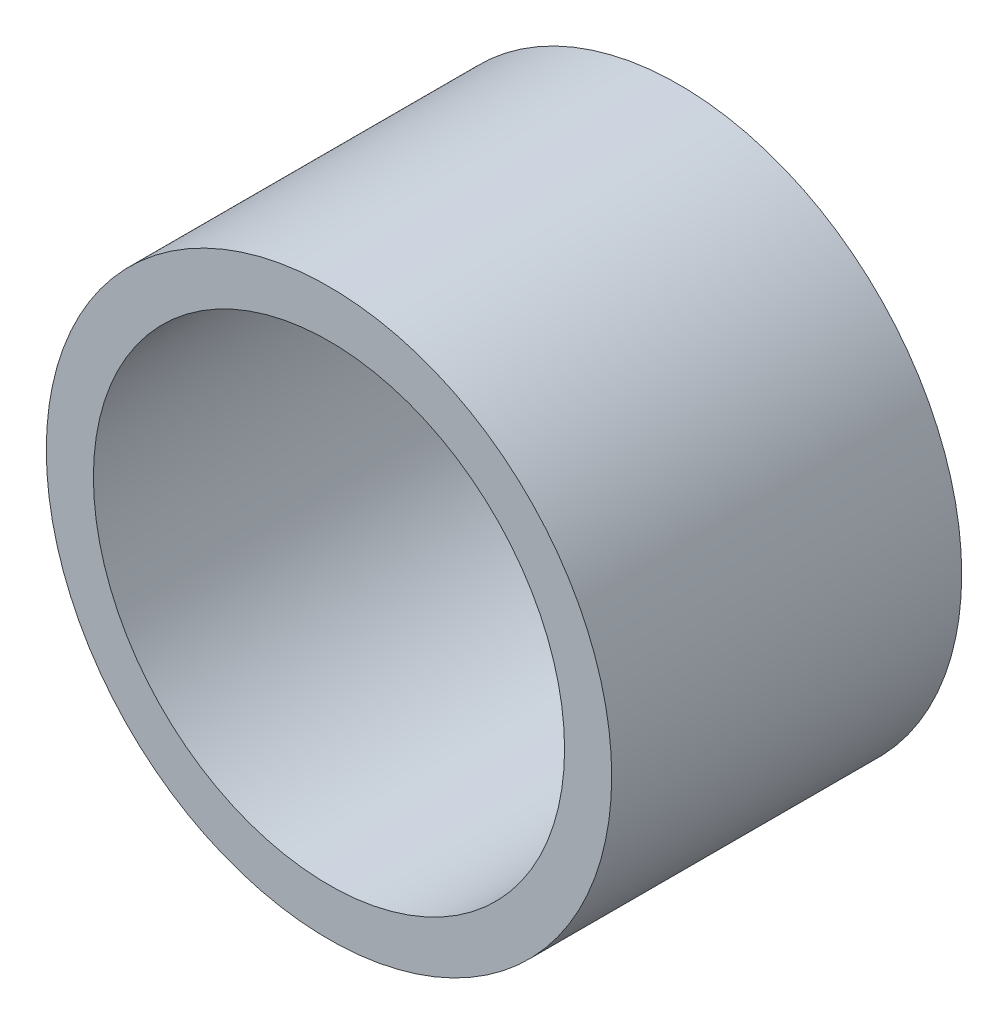
ISO-10303-21;
HEADER;
FILE_DESCRIPTION(('STEP AP214'),'2;1');
FILE_NAME('part.step','',(''),(''),'','','');
FILE_SCHEMA(('AUTOMOTIVE_DESIGN { 1 0 10303 214 1 1 1 1 }'));
ENDSEC;
DATA;
#1=APPLICATION_CONTEXT('core data for automotive mechanical design processes');
#2=APPLICATION_PROTOCOL_DEFINITION('international standard','automotive_design',2000,#1);
#3=PRODUCT_CONTEXT('',#1,'mechanical');
#4=PRODUCT('Part','Part','',(#3));
#5=PRODUCT_RELATED_PRODUCT_CATEGORY('part','',(#4));
#6=PRODUCT_DEFINITION_FORMATION('','',#4);
#7=PRODUCT_DEFINITION_CONTEXT('part definition',#1,'design');
#8=PRODUCT_DEFINITION('design','',#6,#7);
#9=PRODUCT_DEFINITION_SHAPE('','',#8);
#10=(LENGTH_UNIT() NAMED_UNIT(*) SI_UNIT(.MILLI.,.METRE.));
#11=(NAMED_UNIT(*) PLANE_ANGLE_UNIT() SI_UNIT($,.RADIAN.));
#12=(NAMED_UNIT(*) SI_UNIT($,.STERADIAN.) SOLID_ANGLE_UNIT());
#13=UNCERTAINTY_MEASURE_WITH_UNIT(LENGTH_MEASURE(1.E-05),#10,'distance_accuracy_value','');
#14=(GEOMETRIC_REPRESENTATION_CONTEXT(3) GLOBAL_UNCERTAINTY_ASSIGNED_CONTEXT((#13)) GLOBAL_UNIT_ASSIGNED_CONTEXT((#10,
#11,#12)) REPRESENTATION_CONTEXT('',''));
#15=CARTESIAN_POINT('',(0.,0.,0.));
#16=DIRECTION('',(0.,0.,1.));
#17=DIRECTION('',(1.,0.,0.));
#18=AXIS2_PLACEMENT_3D('',#15,#16,#17);
#19=CARTESIAN_POINT('',(0.,0.,26.));
#20=DIRECTION('',(0.,0.,1.));
#21=DIRECTION('',(1.,0.,0.));
#22=AXIS2_PLACEMENT_3D('',#19,#20,#21);
#23=PLANE('',#22);
#24=CARTESIAN_POINT('',(0.,0.,26.));
#25=DIRECTION('',(0.,0.,1.));
#26=DIRECTION('',(1.,0.,0.));
#27=AXIS2_PLACEMENT_3D('',#24,#25,#26);
#28=CIRCLE('',#27,21.);
#29=CARTESIAN_POINT('',(-21.,0.,26.));
#30=VERTEX_POINT('',#29);
#31=EDGE_CURVE('E10',#30,#30,#28,.T.);
#32=ORIENTED_EDGE('',*,*,#31,.T.);
#33=EDGE_LOOP('',(#32));
#34=FACE_BOUND('',#33,.T.);
#35=CARTESIAN_POINT('',(0.,0.,26.));
#36=DIRECTION('',(0.,0.,1.));
#37=DIRECTION('',(1.,0.,0.));
#38=AXIS2_PLACEMENT_3D('',#35,#36,#37);
#39=CIRCLE('',#38,17.5);
#40=CARTESIAN_POINT('',(-17.5,0.,26.));
#41=VERTEX_POINT('',#40);
#42=EDGE_CURVE('E42',#41,#41,#39,.T.);
#43=ORIENTED_EDGE('',*,*,#42,.F.);
#44=EDGE_LOOP('',(#43));
#45=FACE_BOUND('',#44,.T.);
#46=ADVANCED_FACE('F31',(#34,#45),#23,.T.);
#47=CARTESIAN_POINT('',(0.,0.,0.));
#48=DIRECTION('',(0.,0.,1.));
#49=DIRECTION('',(1.,0.,0.));
#50=AXIS2_PLACEMENT_3D('',#47,#48,#49);
#51=PLANE('',#50);
#52=CARTESIAN_POINT('',(0.,0.,0.));
#53=DIRECTION('',(0.,0.,1.));
#54=DIRECTION('',(1.,0.,0.));
#55=AXIS2_PLACEMENT_3D('',#52,#53,#54);
#56=CIRCLE('',#55,21.);
#57=CARTESIAN_POINT('',(-21.,0.,0.));
#58=VERTEX_POINT('',#57);
#59=EDGE_CURVE('E35',#58,#58,#56,.T.);
#60=ORIENTED_EDGE('',*,*,#59,.F.);
#61=EDGE_LOOP('',(#60));
#62=FACE_BOUND('',#61,.T.);
#63=CARTESIAN_POINT('',(0.,0.,0.));
#64=DIRECTION('',(0.,0.,1.));
#65=DIRECTION('',(1.,0.,0.));
#66=AXIS2_PLACEMENT_3D('',#63,#64,#65);
#67=CIRCLE('',#66,17.5);
#68=CARTESIAN_POINT('',(-17.5,0.,0.));
#69=VERTEX_POINT('',#68);
#70=EDGE_CURVE('E44',#69,#69,#67,.T.);
#71=ORIENTED_EDGE('',*,*,#70,.T.);
#72=EDGE_LOOP('',(#71));
#73=FACE_BOUND('',#72,.T.);
#74=ADVANCED_FACE('F54',(#62,#73),#51,.F.);
#75=CARTESIAN_POINT('',(0.,0.,26.));
#76=DIRECTION('',(0.,0.,-1.));
#77=DIRECTION('',(-1.,0.,0.));
#78=AXIS2_PLACEMENT_3D('',#75,#76,#77);
#79=CYLINDRICAL_SURFACE('',#78,21.);
#80=CARTESIAN_POINT('',(-21.,0.,26.));
#81=CARTESIAN_POINT('',(-21.,0.,25.7291666666667));
#82=CARTESIAN_POINT('',(-21.,0.,25.4583333333333));
#83=CARTESIAN_POINT('',(-21.,0.,24.9166666666667));
#84=CARTESIAN_POINT('',(-21.,0.,24.6458333333333));
#85=CARTESIAN_POINT('',(-21.,0.,24.1041666666667));
#86=CARTESIAN_POINT('',(-21.,0.,23.8333333333333));
#87=CARTESIAN_POINT('',(-21.,0.,23.2916666666667));
#88=CARTESIAN_POINT('',(-21.,0.,23.0208333333333));
#89=CARTESIAN_POINT('',(-21.,0.,22.4791666666667));
#90=CARTESIAN_POINT('',(-21.,0.,22.2083333333333));
#91=CARTESIAN_POINT('',(-21.,0.,21.6666666666667));
#92=CARTESIAN_POINT('',(-21.,0.,21.3958333333333));
#93=CARTESIAN_POINT('',(-21.,0.,20.8541666666667));
#94=CARTESIAN_POINT('',(-21.,0.,20.5833333333333));
#95=CARTESIAN_POINT('',(-21.,0.,20.0416666666667));
#96=CARTESIAN_POINT('',(-21.,0.,19.7708333333333));
#97=CARTESIAN_POINT('',(-21.,0.,19.2291666666667));
#98=CARTESIAN_POINT('',(-21.,0.,18.9583333333333));
#99=CARTESIAN_POINT('',(-21.,0.,18.4166666666667));
#100=CARTESIAN_POINT('',(-21.,0.,18.1458333333333));
#101=CARTESIAN_POINT('',(-21.,0.,17.6041666666667));
#102=CARTESIAN_POINT('',(-21.,0.,17.3333333333333));
#103=CARTESIAN_POINT('',(-21.,0.,16.7916666666667));
#104=CARTESIAN_POINT('',(-21.,0.,16.5208333333333));
#105=CARTESIAN_POINT('',(-21.,0.,15.9791666666667));
#106=CARTESIAN_POINT('',(-21.,0.,15.7083333333333));
#107=CARTESIAN_POINT('',(-21.,0.,15.1666666666667));
#108=CARTESIAN_POINT('',(-21.,0.,14.8958333333333));
#109=CARTESIAN_POINT('',(-21.,0.,14.3541666666667));
#110=CARTESIAN_POINT('',(-21.,0.,14.0833333333333));
#111=CARTESIAN_POINT('',(-21.,0.,13.5416666666667));
#112=CARTESIAN_POINT('',(-21.,0.,13.2708333333333));
#113=CARTESIAN_POINT('',(-21.,0.,12.7291666666667));
#114=CARTESIAN_POINT('',(-21.,0.,12.4583333333333));
#115=CARTESIAN_POINT('',(-21.,0.,11.9166666666667));
#116=CARTESIAN_POINT('',(-21.,0.,11.6458333333333));
#117=CARTESIAN_POINT('',(-21.,0.,11.1041666666667));
#118=CARTESIAN_POINT('',(-21.,0.,10.8333333333333));
#119=CARTESIAN_POINT('',(-21.,0.,10.2916666666667));
#120=CARTESIAN_POINT('',(-21.,0.,10.0208333333333));
#121=CARTESIAN_POINT('',(-21.,0.,9.47916666666667));
#122=CARTESIAN_POINT('',(-21.,0.,9.20833333333333));
#123=CARTESIAN_POINT('',(-21.,0.,8.66666666666667));
#124=CARTESIAN_POINT('',(-21.,0.,8.39583333333333));
#125=CARTESIAN_POINT('',(-21.,0.,7.85416666666667));
#126=CARTESIAN_POINT('',(-21.,0.,7.58333333333333));
#127=CARTESIAN_POINT('',(-21.,0.,7.04166666666667));
#128=CARTESIAN_POINT('',(-21.,0.,6.77083333333333));
#129=CARTESIAN_POINT('',(-21.,0.,6.22916666666667));
#130=CARTESIAN_POINT('',(-21.,0.,5.95833333333333));
#131=CARTESIAN_POINT('',(-21.,0.,5.41666666666667));
#132=CARTESIAN_POINT('',(-21.,0.,5.14583333333333));
#133=CARTESIAN_POINT('',(-21.,0.,4.60416666666667));
#134=CARTESIAN_POINT('',(-21.,0.,4.33333333333333));
#135=CARTESIAN_POINT('',(-21.,0.,3.79166666666667));
#136=CARTESIAN_POINT('',(-21.,0.,3.52083333333333));
#137=CARTESIAN_POINT('',(-21.,0.,2.97916666666667));
#138=CARTESIAN_POINT('',(-21.,0.,2.70833333333333));
#139=CARTESIAN_POINT('',(-21.,0.,2.16666666666667));
#140=CARTESIAN_POINT('',(-21.,0.,1.89583333333333));
#141=CARTESIAN_POINT('',(-21.,0.,1.35416666666667));
#142=CARTESIAN_POINT('',(-21.,0.,1.08333333333333));
#143=CARTESIAN_POINT('',(-21.,0.,0.541666666666667));
#144=CARTESIAN_POINT('',(-21.,0.,0.270833333333334));
#145=CARTESIAN_POINT('',(-21.,0.,0.));
#146=B_SPLINE_CURVE_WITH_KNOTS('',3,(#80,#81,#82,#83,#84,#85,#86,#87,#88,#89,#90,#91,#92,#93,
#94,#95,#96,#97,#98,#99,#100,#101,#102,#103,#104,#105,#106,#107,#108,#109,#110,#111,#112,#113,
#114,#115,#116,#117,#118,#119,#120,#121,#122,#123,#124,#125,#126,#127,#128,#129,#130,#131,#132,
#133,#134,#135,#136,#137,#138,#139,#140,#141,#142,#143,#144,#145),.UNSPECIFIED.,.F.,.F.,(4,2,2,
2,2,2,2,2,2,2,2,2,2,2,2,2,2,2,2,2,2,2,2,2,2,2,2,2,2,2,2,2,4),(0.,0.812499999999997,1.625,2.4375,
3.25,4.0625,4.875,5.6875,6.5,7.3125,8.125,8.93749999999999,9.74999999999999,10.5625,11.375,
12.1875,13.,13.8125,14.625,15.4375,16.25,17.0625,17.875,18.6875,19.5,20.3125,21.125,21.9375,
22.75,23.5625,24.375,25.1875,26.),.UNSPECIFIED.);
#147=EDGE_CURVE('BSEAM33',#30,#58,#146,.T.);
#148=ORIENTED_EDGE('',*,*,#31,.F.);
#149=ORIENTED_EDGE('',*,*,#59,.T.);
#150=ORIENTED_EDGE('',*,*,#147,.T.);
#151=ORIENTED_EDGE('',*,*,#147,.F.);
#152=EDGE_LOOP('',(#148,#150,#149,#151));
#153=FACE_BOUND('',#152,.T.);
#154=ADVANCED_FACE('F33',(#153),#79,.T.);
#155=CARTESIAN_POINT('',(0.,0.,26.));
#156=DIRECTION('',(0.,0.,-1.));
#157=DIRECTION('',(-1.,0.,0.));
#158=AXIS2_PLACEMENT_3D('',#155,#156,#157);
#159=CYLINDRICAL_SURFACE('',#158,17.5);
#160=CARTESIAN_POINT('',(-17.5,0.,26.));
#161=CARTESIAN_POINT('',(-17.5,0.,25.7291666666667));
#162=CARTESIAN_POINT('',(-17.5,0.,25.4583333333333));
#163=CARTESIAN_POINT('',(-17.5,0.,24.9166666666667));
#164=CARTESIAN_POINT('',(-17.5,0.,24.6458333333333));
#165=CARTESIAN_POINT('',(-17.5,0.,24.1041666666667));
#166=CARTESIAN_POINT('',(-17.5,0.,23.8333333333333));
#167=CARTESIAN_POINT('',(-17.5,0.,23.2916666666667));
#168=CARTESIAN_POINT('',(-17.5,0.,23.0208333333333));
#169=CARTESIAN_POINT('',(-17.5,0.,22.4791666666667));
#170=CARTESIAN_POINT('',(-17.5,0.,22.2083333333333));
#171=CARTESIAN_POINT('',(-17.5,0.,21.6666666666667));
#172=CARTESIAN_POINT('',(-17.5,0.,21.3958333333333));
#173=CARTESIAN_POINT('',(-17.5,0.,20.8541666666667));
#174=CARTESIAN_POINT('',(-17.5,0.,20.5833333333333));
#175=CARTESIAN_POINT('',(-17.5,0.,20.0416666666667));
#176=CARTESIAN_POINT('',(-17.5,0.,19.7708333333333));
#177=CARTESIAN_POINT('',(-17.5,0.,19.2291666666667));
#178=CARTESIAN_POINT('',(-17.5,0.,18.9583333333333));
#179=CARTESIAN_POINT('',(-17.5,0.,18.4166666666667));
#180=CARTESIAN_POINT('',(-17.5,0.,18.1458333333333));
#181=CARTESIAN_POINT('',(-17.5,0.,17.6041666666667));
#182=CARTESIAN_POINT('',(-17.5,0.,17.3333333333333));
#183=CARTESIAN_POINT('',(-17.5,0.,16.7916666666667));
#184=CARTESIAN_POINT('',(-17.5,0.,16.5208333333333));
#185=CARTESIAN_POINT('',(-17.5,0.,15.9791666666667));
#186=CARTESIAN_POINT('',(-17.5,0.,15.7083333333333));
#187=CARTESIAN_POINT('',(-17.5,0.,15.1666666666667));
#188=CARTESIAN_POINT('',(-17.5,0.,14.8958333333333));
#189=CARTESIAN_POINT('',(-17.5,0.,14.3541666666667));
#190=CARTESIAN_POINT('',(-17.5,0.,14.0833333333333));
#191=CARTESIAN_POINT('',(-17.5,0.,13.5416666666667));
#192=CARTESIAN_POINT('',(-17.5,0.,13.2708333333333));
#193=CARTESIAN_POINT('',(-17.5,0.,12.7291666666667));
#194=CARTESIAN_POINT('',(-17.5,0.,12.4583333333333));
#195=CARTESIAN_POINT('',(-17.5,0.,11.9166666666667));
#196=CARTESIAN_POINT('',(-17.5,0.,11.6458333333333));
#197=CARTESIAN_POINT('',(-17.5,0.,11.1041666666667));
#198=CARTESIAN_POINT('',(-17.5,0.,10.8333333333333));
#199=CARTESIAN_POINT('',(-17.5,0.,10.2916666666667));
#200=CARTESIAN_POINT('',(-17.5,0.,10.0208333333333));
#201=CARTESIAN_POINT('',(-17.5,0.,9.47916666666667));
#202=CARTESIAN_POINT('',(-17.5,0.,9.20833333333333));
#203=CARTESIAN_POINT('',(-17.5,0.,8.66666666666667));
#204=CARTESIAN_POINT('',(-17.5,0.,8.39583333333333));
#205=CARTESIAN_POINT('',(-17.5,0.,7.85416666666667));
#206=CARTESIAN_POINT('',(-17.5,0.,7.58333333333333));
#207=CARTESIAN_POINT('',(-17.5,0.,7.04166666666667));
#208=CARTESIAN_POINT('',(-17.5,0.,6.77083333333333));
#209=CARTESIAN_POINT('',(-17.5,0.,6.22916666666667));
#210=CARTESIAN_POINT('',(-17.5,0.,5.95833333333333));
#211=CARTESIAN_POINT('',(-17.5,0.,5.41666666666667));
#212=CARTESIAN_POINT('',(-17.5,0.,5.14583333333333));
#213=CARTESIAN_POINT('',(-17.5,0.,4.60416666666667));
#214=CARTESIAN_POINT('',(-17.5,0.,4.33333333333333));
#215=CARTESIAN_POINT('',(-17.5,0.,3.79166666666667));
#216=CARTESIAN_POINT('',(-17.5,0.,3.52083333333333));
#217=CARTESIAN_POINT('',(-17.5,0.,2.97916666666667));
#218=CARTESIAN_POINT('',(-17.5,0.,2.70833333333333));
#219=CARTESIAN_POINT('',(-17.5,0.,2.16666666666667));
#220=CARTESIAN_POINT('',(-17.5,0.,1.89583333333333));
#221=CARTESIAN_POINT('',(-17.5,0.,1.35416666666667));
#222=CARTESIAN_POINT('',(-17.5,0.,1.08333333333333));
#223=CARTESIAN_POINT('',(-17.5,0.,0.541666666666667));
#224=CARTESIAN_POINT('',(-17.5,0.,0.270833333333334));
#225=CARTESIAN_POINT('',(-17.5,0.,0.));
#226=B_SPLINE_CURVE_WITH_KNOTS('',3,(#160,#161,#162,#163,#164,#165,#166,#167,#168,#169,#170,
#171,#172,#173,#174,#175,#176,#177,#178,#179,#180,#181,#182,#183,#184,#185,#186,#187,#188,#189,
#190,#191,#192,#193,#194,#195,#196,#197,#198,#199,#200,#201,#202,#203,#204,#205,#206,#207,#208,
#209,#210,#211,#212,#213,#214,#215,#216,#217,#218,#219,#220,#221,#222,#223,#224,#225),
.UNSPECIFIED.,.F.,.F.,(4,2,2,2,2,2,2,2,2,2,2,2,2,2,2,2,2,2,2,2,2,2,2,2,2,2,2,2,2,2,2,2,4),(0.,
0.812500000000001,1.625,2.4375,3.25,4.0625,4.875,5.6875,6.5,7.3125,8.125,8.9375,9.75,10.5625,
11.375,12.1875,13.,13.8125,14.625,15.4375,16.25,17.0625,17.875,18.6875,19.5,20.3125,21.125,
21.9375,22.75,23.5625,24.375,25.1875,26.),.UNSPECIFIED.);
#227=EDGE_CURVE('BSEAM50',#41,#69,#226,.T.);
#228=ORIENTED_EDGE('',*,*,#42,.T.);
#229=ORIENTED_EDGE('',*,*,#70,.F.);
#230=ORIENTED_EDGE('',*,*,#227,.T.);
#231=ORIENTED_EDGE('',*,*,#227,.F.);
#232=EDGE_LOOP('',(#228,#230,#229,#231));
#233=FACE_BOUND('',#232,.T.);
#234=ADVANCED_FACE('F50',(#233),#159,.F.);
#235=CLOSED_SHELL('',(#46,#74,#154,#234));
#236=MANIFOLD_SOLID_BREP('B2',#235);
#237=ADVANCED_BREP_SHAPE_REPRESENTATION('',(#18,#236),#14);
#238=SHAPE_DEFINITION_REPRESENTATION(#9,#237);
ENDSEC;
END-ISO-10303-21;
